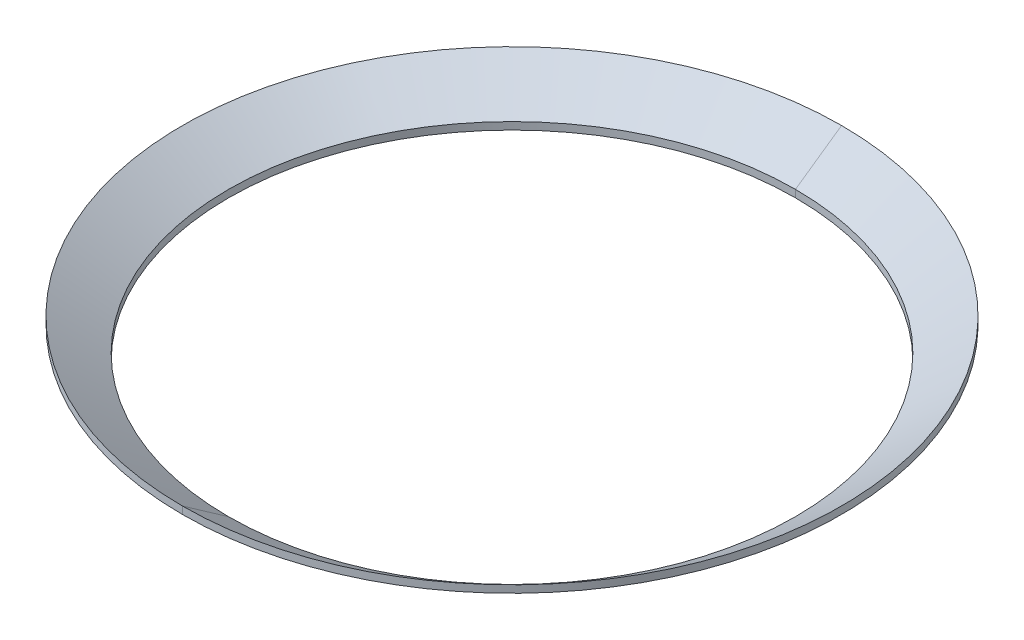
ISO-10303-21;
HEADER;
FILE_DESCRIPTION(('STEP AP214'),'2;1');
FILE_NAME('part.step','',(''),(''),'','','');
FILE_SCHEMA(('AUTOMOTIVE_DESIGN { 1 0 10303 214 1 1 1 1 }'));
ENDSEC;
DATA;
#1=APPLICATION_CONTEXT('core data for automotive mechanical design processes');
#2=APPLICATION_PROTOCOL_DEFINITION('international standard','automotive_design',2000,#1);
#3=PRODUCT_CONTEXT('',#1,'mechanical');
#4=PRODUCT('Part','Part','',(#3));
#5=PRODUCT_RELATED_PRODUCT_CATEGORY('part','',(#4));
#6=PRODUCT_DEFINITION_FORMATION('','',#4);
#7=PRODUCT_DEFINITION_CONTEXT('part definition',#1,'design');
#8=PRODUCT_DEFINITION('design','',#6,#7);
#9=PRODUCT_DEFINITION_SHAPE('','',#8);
#10=(LENGTH_UNIT() NAMED_UNIT(*) SI_UNIT(.MILLI.,.METRE.));
#11=(NAMED_UNIT(*) PLANE_ANGLE_UNIT() SI_UNIT($,.RADIAN.));
#12=(NAMED_UNIT(*) SI_UNIT($,.STERADIAN.) SOLID_ANGLE_UNIT());
#13=UNCERTAINTY_MEASURE_WITH_UNIT(LENGTH_MEASURE(1.E-05),#10,'distance_accuracy_value','');
#14=(GEOMETRIC_REPRESENTATION_CONTEXT(3) GLOBAL_UNCERTAINTY_ASSIGNED_CONTEXT((#13)) GLOBAL_UNIT_ASSIGNED_CONTEXT((#10,
#11,#12)) REPRESENTATION_CONTEXT('',''));
#15=CARTESIAN_POINT('',(0.,0.,0.));
#16=DIRECTION('',(0.,0.,1.));
#17=DIRECTION('',(1.,0.,0.));
#18=AXIS2_PLACEMENT_3D('',#15,#16,#17);
#19=CARTESIAN_POINT('',(0.,0.860000000000194,0.));
#20=DIRECTION('',(0.,1.,0.));
#21=DIRECTION('',(0.,0.,1.));
#22=AXIS2_PLACEMENT_3D('',#19,#20,#21);
#23=CONICAL_SURFACE('',#22,7.14999999999932,0.959931088596922);
#24=CARTESIAN_POINT('',(0.,0.159792461562725,0.));
#25=DIRECTION('',(0.,1.,0.));
#26=DIRECTION('',(0.,0.,1.));
#27=AXIS2_PLACEMENT_3D('',#24,#25,#26);
#28=CIRCLE('',#27,6.14999999967403);
#29=CARTESIAN_POINT('',(0.,0.159792461562725,-6.14999999967403));
#30=VERTEX_POINT('',#29);
#31=CARTESIAN_POINT('',(0.,0.159792461562725,6.14999999967403));
#32=VERTEX_POINT('',#31);
#33=EDGE_CURVE('E106',#30,#32,#28,.T.);
#34=ORIENTED_EDGE('',*,*,#33,.F.);
#35=DIRECTION('',(0.,0.573576436351013,-0.819152044289015));
#36=VECTOR('',#35,1.);
#37=CARTESIAN_POINT('',(0.,0.860000000000194,-7.14999999999932));
#38=LINE('',#37,#36);
#39=CARTESIAN_POINT('',(0.,0.860000000000416,-7.14999999999966));
#40=VERTEX_POINT('',#39);
#41=EDGE_CURVE('E10',#30,#40,#38,.T.);
#42=ORIENTED_EDGE('',*,*,#41,.T.);
#43=CARTESIAN_POINT('',(0.,0.860000000000416,0.));
#44=DIRECTION('',(0.,-1.,0.));
#45=DIRECTION('',(0.,0.,1.));
#46=AXIS2_PLACEMENT_3D('',#43,#44,#45);
#47=CIRCLE('',#46,7.14999999999966);
#48=CARTESIAN_POINT('',(0.,0.860000000000416,7.14999999999966));
#49=VERTEX_POINT('',#48);
#50=EDGE_CURVE('E77',#49,#40,#47,.T.);
#51=ORIENTED_EDGE('',*,*,#50,.F.);
#52=DIRECTION('',(0.,0.573576436351013,0.819152044289015));
#53=VECTOR('',#52,1.);
#54=CARTESIAN_POINT('',(0.,0.860000000000194,7.14999999999932));
#55=LINE('',#54,#53);
#56=EDGE_CURVE('E82',#32,#49,#55,.T.);
#57=ORIENTED_EDGE('',*,*,#56,.F.);
#58=EDGE_LOOP('',(#34,#42,#51,#57));
#59=FACE_BOUND('',#58,.T.);
#60=ADVANCED_FACE('F15',(#59),#23,.F.);
#61=CARTESIAN_POINT('',(0.,0.86,0.));
#62=DIRECTION('',(0.,-1.,0.));
#63=DIRECTION('',(0.,0.,-1.));
#64=AXIS2_PLACEMENT_3D('',#61,#62,#63);
#65=CYLINDRICAL_SURFACE('',#64,7.15);
#66=CARTESIAN_POINT('',(0.,0.860000000000416,0.));
#67=DIRECTION('',(0.,-1.,0.));
#68=DIRECTION('',(0.,0.,1.));
#69=AXIS2_PLACEMENT_3D('',#66,#67,#68);
#70=CIRCLE('',#69,7.14999999999966);
#71=EDGE_CURVE('E26',#40,#49,#70,.T.);
#72=ORIENTED_EDGE('',*,*,#71,.T.);
#73=DIRECTION('',(0.,-1.,0.));
#74=VECTOR('',#73,1.);
#75=CARTESIAN_POINT('',(0.,0.86,7.15));
#76=LINE('',#75,#74);
#77=CARTESIAN_POINT('',(0.,0.700207538209696,7.1500000000001));
#78=VERTEX_POINT('',#77);
#79=EDGE_CURVE('E105',#49,#78,#76,.T.);
#80=ORIENTED_EDGE('',*,*,#79,.T.);
#81=CARTESIAN_POINT('',(0.,0.700207538209696,0.));
#82=DIRECTION('',(0.,1.,0.));
#83=DIRECTION('',(0.,0.,-1.));
#84=AXIS2_PLACEMENT_3D('',#81,#82,#83);
#85=CIRCLE('',#84,7.15);
#86=CARTESIAN_POINT('',(0.,0.700207538209696,-7.1500000000001));
#87=VERTEX_POINT('',#86);
#88=EDGE_CURVE('E98',#78,#87,#85,.T.);
#89=ORIENTED_EDGE('',*,*,#88,.T.);
#90=DIRECTION('',(0.,-1.,0.));
#91=VECTOR('',#90,1.);
#92=CARTESIAN_POINT('',(0.,0.86,-7.15));
#93=LINE('',#92,#91);
#94=EDGE_CURVE('E115',#40,#87,#93,.T.);
#95=ORIENTED_EDGE('',*,*,#94,.F.);
#96=EDGE_LOOP('',(#72,#80,#89,#95));
#97=FACE_BOUND('',#96,.T.);
#98=ADVANCED_FACE('F110',(#97),#65,.T.);
#99=CARTESIAN_POINT('',(0.,0.86,0.));
#100=DIRECTION('',(0.,-1.,0.));
#101=DIRECTION('',(0.,0.,-1.));
#102=AXIS2_PLACEMENT_3D('',#99,#100,#101);
#103=CYLINDRICAL_SURFACE('',#102,6.15);
#104=ORIENTED_EDGE('',*,*,#33,.T.);
#105=DIRECTION('',(0.,-1.,0.));
#106=VECTOR('',#105,1.);
#107=CARTESIAN_POINT('',(0.,0.86,6.15));
#108=LINE('',#107,#106);
#109=CARTESIAN_POINT('',(0.,0.,6.15));
#110=VERTEX_POINT('',#109);
#111=EDGE_CURVE('E140',#32,#110,#108,.T.);
#112=ORIENTED_EDGE('',*,*,#111,.T.);
#113=CARTESIAN_POINT('',(0.,-1.4213890481285E-13,0.));
#114=DIRECTION('',(0.,1.,0.));
#115=DIRECTION('',(0.,0.,-1.));
#116=AXIS2_PLACEMENT_3D('',#113,#114,#115);
#117=CIRCLE('',#116,6.15);
#118=CARTESIAN_POINT('',(0.,-1.4213890481285E-13,-6.15));
#119=VERTEX_POINT('',#118);
#120=EDGE_CURVE('E57',#119,#110,#117,.T.);
#121=ORIENTED_EDGE('',*,*,#120,.F.);
#122=DIRECTION('',(0.,-1.,0.));
#123=VECTOR('',#122,1.);
#124=CARTESIAN_POINT('',(0.,0.86,-6.15));
#125=LINE('',#124,#123);
#126=EDGE_CURVE('E41',#30,#119,#125,.T.);
#127=ORIENTED_EDGE('',*,*,#126,.F.);
#128=EDGE_LOOP('',(#104,#112,#121,#127));
#129=FACE_BOUND('',#128,.T.);
#130=ADVANCED_FACE('F17',(#129),#103,.F.);
#131=CARTESIAN_POINT('',(0.,0.700207538209541,0.));
#132=DIRECTION('',(0.,1.,0.));
#133=DIRECTION('',(0.,0.,1.));
#134=AXIS2_PLACEMENT_3D('',#131,#132,#133);
#135=CONICAL_SURFACE('',#134,7.14999999999988,0.959931088596906);
#136=CARTESIAN_POINT('',(0.,-1.4213890481285E-13,0.));
#137=DIRECTION('',(0.,1.,0.));
#138=DIRECTION('',(0.,0.,-1.));
#139=AXIS2_PLACEMENT_3D('',#136,#137,#138);
#140=CIRCLE('',#139,6.15);
#141=EDGE_CURVE('E137',#110,#119,#140,.T.);
#142=ORIENTED_EDGE('',*,*,#141,.T.);
#143=DIRECTION('',(0.,0.573576436351026,-0.819152044289006));
#144=VECTOR('',#143,1.);
#145=CARTESIAN_POINT('',(0.,0.700207538209541,-7.14999999999988));
#146=LINE('',#145,#144);
#147=EDGE_CURVE('E101',#119,#87,#146,.T.);
#148=ORIENTED_EDGE('',*,*,#147,.T.);
#149=ORIENTED_EDGE('',*,*,#88,.F.);
#150=DIRECTION('',(0.,0.573576436351026,0.819152044289006));
#151=VECTOR('',#150,1.);
#152=CARTESIAN_POINT('',(0.,0.700207538209541,7.14999999999988));
#153=LINE('',#152,#151);
#154=EDGE_CURVE('E88',#110,#78,#153,.T.);
#155=ORIENTED_EDGE('',*,*,#154,.F.);
#156=EDGE_LOOP('',(#142,#148,#149,#155));
#157=FACE_BOUND('',#156,.T.);
#158=ADVANCED_FACE('F100',(#157),#135,.T.);
#159=CARTESIAN_POINT('',(0.,0.860000000000194,0.));
#160=DIRECTION('',(0.,1.,0.));
#161=DIRECTION('',(0.,0.,1.));
#162=AXIS2_PLACEMENT_3D('',#159,#160,#161);
#163=CONICAL_SURFACE('',#162,7.14999999999932,0.959931088596922);
#164=ORIENTED_EDGE('',*,*,#41,.F.);
#165=CARTESIAN_POINT('',(0.,0.159792461562725,0.));
#166=DIRECTION('',(0.,1.,0.));
#167=DIRECTION('',(0.,0.,1.));
#168=AXIS2_PLACEMENT_3D('',#165,#166,#167);
#169=CIRCLE('',#168,6.14999999967403);
#170=EDGE_CURVE('E117',#32,#30,#169,.T.);
#171=ORIENTED_EDGE('',*,*,#170,.F.);
#172=ORIENTED_EDGE('',*,*,#56,.T.);
#173=ORIENTED_EDGE('',*,*,#71,.F.);
#174=EDGE_LOOP('',(#164,#171,#172,#173));
#175=FACE_BOUND('',#174,.T.);
#176=ADVANCED_FACE('F152',(#175),#163,.F.);
#177=CARTESIAN_POINT('',(0.,0.86,0.));
#178=DIRECTION('',(0.,-1.,0.));
#179=DIRECTION('',(0.,0.,-1.));
#180=AXIS2_PLACEMENT_3D('',#177,#178,#179);
#181=CYLINDRICAL_SURFACE('',#180,7.15);
#182=ORIENTED_EDGE('',*,*,#79,.F.);
#183=ORIENTED_EDGE('',*,*,#50,.T.);
#184=ORIENTED_EDGE('',*,*,#94,.T.);
#185=CARTESIAN_POINT('',(0.,0.700207538209696,0.));
#186=DIRECTION('',(0.,1.,0.));
#187=DIRECTION('',(0.,0.,-1.));
#188=AXIS2_PLACEMENT_3D('',#185,#186,#187);
#189=CIRCLE('',#188,7.15);
#190=EDGE_CURVE('E19',#87,#78,#189,.T.);
#191=ORIENTED_EDGE('',*,*,#190,.T.);
#192=EDGE_LOOP('',(#182,#183,#184,#191));
#193=FACE_BOUND('',#192,.T.);
#194=ADVANCED_FACE('F114',(#193),#181,.T.);
#195=CARTESIAN_POINT('',(0.,0.86,0.));
#196=DIRECTION('',(0.,-1.,0.));
#197=DIRECTION('',(0.,0.,-1.));
#198=AXIS2_PLACEMENT_3D('',#195,#196,#197);
#199=CYLINDRICAL_SURFACE('',#198,6.15);
#200=ORIENTED_EDGE('',*,*,#111,.F.);
#201=ORIENTED_EDGE('',*,*,#170,.T.);
#202=ORIENTED_EDGE('',*,*,#126,.T.);
#203=ORIENTED_EDGE('',*,*,#141,.F.);
#204=EDGE_LOOP('',(#200,#201,#202,#203));
#205=FACE_BOUND('',#204,.T.);
#206=ADVANCED_FACE('F154',(#205),#199,.F.);
#207=CARTESIAN_POINT('',(0.,0.700207538209541,0.));
#208=DIRECTION('',(0.,1.,0.));
#209=DIRECTION('',(0.,0.,1.));
#210=AXIS2_PLACEMENT_3D('',#207,#208,#209);
#211=CONICAL_SURFACE('',#210,7.14999999999988,0.959931088596906);
#212=ORIENTED_EDGE('',*,*,#147,.F.);
#213=ORIENTED_EDGE('',*,*,#120,.T.);
#214=ORIENTED_EDGE('',*,*,#154,.T.);
#215=ORIENTED_EDGE('',*,*,#190,.F.);
#216=EDGE_LOOP('',(#212,#213,#214,#215));
#217=FACE_BOUND('',#216,.T.);
#218=ADVANCED_FACE('F90',(#217),#211,.T.);
#219=CLOSED_SHELL('',(#60,#98,#130,#158,#176,#194,#206,#218));
#220=MANIFOLD_SOLID_BREP('B1',#219);
#221=ADVANCED_BREP_SHAPE_REPRESENTATION('',(#18,#220),#14);
#222=SHAPE_DEFINITION_REPRESENTATION(#9,#221);
ENDSEC;
END-ISO-10303-21;
